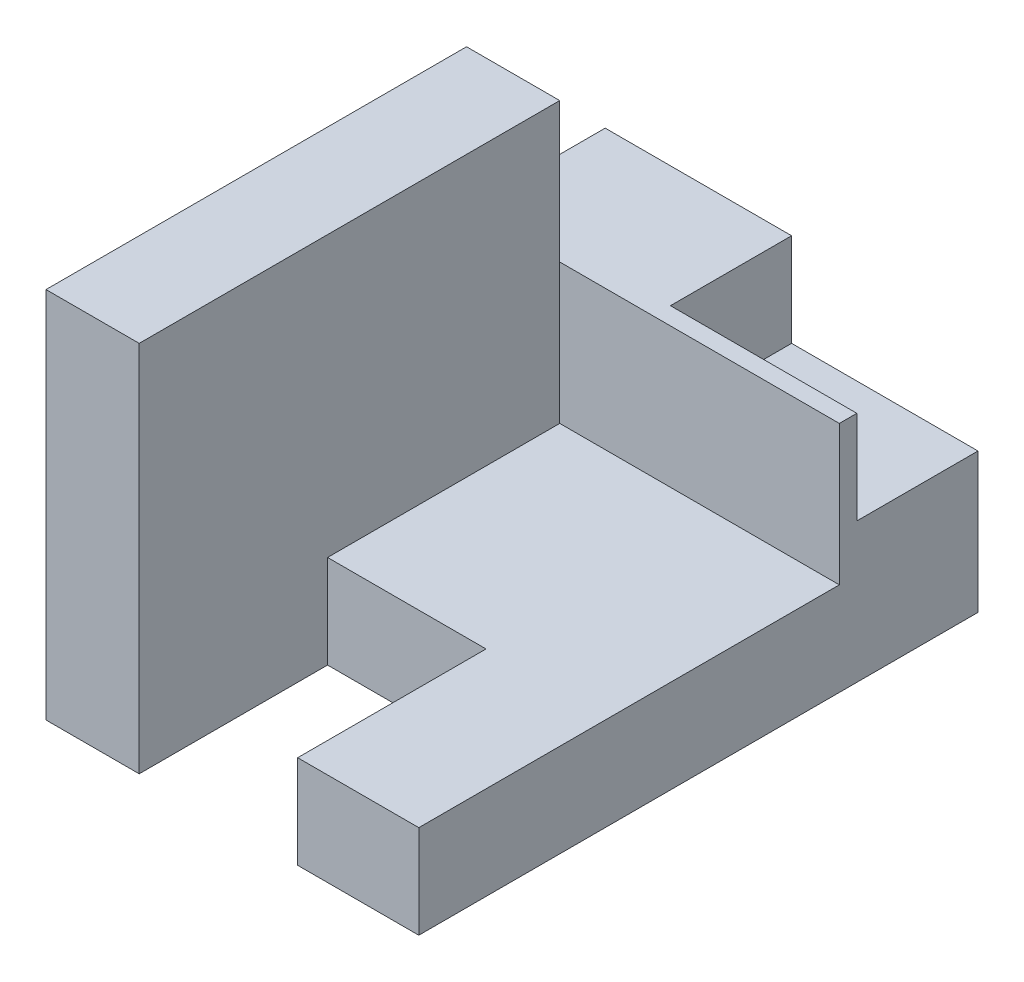
ISO-10303-21;
HEADER;
FILE_DESCRIPTION(('STEP AP214'),'2;1');
FILE_NAME('part.step','',(''),(''),'','','');
FILE_SCHEMA(('AUTOMOTIVE_DESIGN { 1 0 10303 214 1 1 1 1 }'));
ENDSEC;
DATA;
#1=APPLICATION_CONTEXT('core data for automotive mechanical design processes');
#2=APPLICATION_PROTOCOL_DEFINITION('international standard','automotive_design',2000,#1);
#3=PRODUCT_CONTEXT('',#1,'mechanical');
#4=PRODUCT('Part','Part','',(#3));
#5=PRODUCT_RELATED_PRODUCT_CATEGORY('part','',(#4));
#6=PRODUCT_DEFINITION_FORMATION('','',#4);
#7=PRODUCT_DEFINITION_CONTEXT('part definition',#1,'design');
#8=PRODUCT_DEFINITION('design','',#6,#7);
#9=PRODUCT_DEFINITION_SHAPE('','',#8);
#10=(LENGTH_UNIT() NAMED_UNIT(*) SI_UNIT(.MILLI.,.METRE.));
#11=(NAMED_UNIT(*) PLANE_ANGLE_UNIT() SI_UNIT($,.RADIAN.));
#12=(NAMED_UNIT(*) SI_UNIT($,.STERADIAN.) SOLID_ANGLE_UNIT());
#13=UNCERTAINTY_MEASURE_WITH_UNIT(LENGTH_MEASURE(1.E-05),#10,'distance_accuracy_value','');
#14=(GEOMETRIC_REPRESENTATION_CONTEXT(3) GLOBAL_UNCERTAINTY_ASSIGNED_CONTEXT((#13)) GLOBAL_UNIT_ASSIGNED_CONTEXT((#10,
#11,#12)) REPRESENTATION_CONTEXT('',''));
#15=CARTESIAN_POINT('',(0.,0.,0.));
#16=DIRECTION('',(0.,0.,1.));
#17=DIRECTION('',(1.,0.,0.));
#18=AXIS2_PLACEMENT_3D('',#15,#16,#17);
#19=CARTESIAN_POINT('',(40.,0.,60.));
#20=DIRECTION('',(-1.,0.,0.));
#21=DIRECTION('',(0.,0.,1.));
#22=AXIS2_PLACEMENT_3D('',#19,#20,#21);
#23=PLANE('',#22);
#24=DIRECTION('',(0.,0.,-1.));
#25=VECTOR('',#24,1.);
#26=CARTESIAN_POINT('',(40.,15.,0.));
#27=LINE('',#26,#25);
#28=CARTESIAN_POINT('',(40.,15.,13.));
#29=VERTEX_POINT('',#28);
#30=CARTESIAN_POINT('',(40.,15.,0.));
#31=VERTEX_POINT('',#30);
#32=EDGE_CURVE('E148',#29,#31,#27,.T.);
#33=ORIENTED_EDGE('',*,*,#32,.F.);
#34=DIRECTION('',(0.,1.,0.));
#35=VECTOR('',#34,1.);
#36=CARTESIAN_POINT('',(40.,15.,13.));
#37=LINE('',#36,#35);
#38=CARTESIAN_POINT('',(40.,25.,13.));
#39=VERTEX_POINT('',#38);
#40=EDGE_CURVE('E159',#29,#39,#37,.T.);
#41=ORIENTED_EDGE('',*,*,#40,.T.);
#42=DIRECTION('',(0.,0.,-1.));
#43=VECTOR('',#42,1.);
#44=CARTESIAN_POINT('',(40.,25.,0.));
#45=LINE('',#44,#43);
#46=CARTESIAN_POINT('',(40.,25.,14.8777848939515));
#47=VERTEX_POINT('',#46);
#48=EDGE_CURVE('E168',#47,#39,#45,.T.);
#49=ORIENTED_EDGE('',*,*,#48,.F.);
#50=DIRECTION('',(0.,1.,0.));
#51=VECTOR('',#50,1.);
#52=CARTESIAN_POINT('',(40.,10.,14.8777848939515));
#53=LINE('',#52,#51);
#54=CARTESIAN_POINT('',(40.,10.,14.8777848939515));
#55=VERTEX_POINT('',#54);
#56=EDGE_CURVE('E184',#55,#47,#53,.T.);
#57=ORIENTED_EDGE('',*,*,#56,.F.);
#58=DIRECTION('',(0.,0.,-1.));
#59=VECTOR('',#58,1.);
#60=CARTESIAN_POINT('',(40.,10.,60.));
#61=LINE('',#60,#59);
#62=CARTESIAN_POINT('',(40.,10.,60.));
#63=VERTEX_POINT('',#62);
#64=EDGE_CURVE('E179',#63,#55,#61,.T.);
#65=ORIENTED_EDGE('',*,*,#64,.F.);
#66=DIRECTION('',(0.,1.,0.));
#67=VECTOR('',#66,1.);
#68=CARTESIAN_POINT('',(40.,0.,60.));
#69=LINE('',#68,#67);
#70=CARTESIAN_POINT('',(40.,0.,60.));
#71=VERTEX_POINT('',#70);
#72=EDGE_CURVE('E221',#71,#63,#69,.T.);
#73=ORIENTED_EDGE('',*,*,#72,.F.);
#74=DIRECTION('',(0.,0.,-1.));
#75=VECTOR('',#74,1.);
#76=CARTESIAN_POINT('',(40.,0.,60.));
#77=LINE('',#76,#75);
#78=CARTESIAN_POINT('',(40.,0.,0.));
#79=VERTEX_POINT('',#78);
#80=EDGE_CURVE('E233',#71,#79,#77,.T.);
#81=ORIENTED_EDGE('',*,*,#80,.T.);
#82=DIRECTION('',(0.,1.,0.));
#83=VECTOR('',#82,1.);
#84=CARTESIAN_POINT('',(40.,0.,0.));
#85=LINE('',#84,#83);
#86=EDGE_CURVE('E217',#79,#31,#85,.T.);
#87=ORIENTED_EDGE('',*,*,#86,.T.);
#88=EDGE_LOOP('',(#33,#41,#49,#57,#65,#73,#81,#87));
#89=FACE_BOUND('',#88,.T.);
#90=ADVANCED_FACE('F33',(#89),#23,.F.);
#91=CARTESIAN_POINT('',(0.,0.,0.));
#92=DIRECTION('',(0.,0.,-1.));
#93=DIRECTION('',(-1.,0.,0.));
#94=AXIS2_PLACEMENT_3D('',#91,#92,#93);
#95=PLANE('',#94);
#96=DIRECTION('',(0.,1.,0.));
#97=VECTOR('',#96,1.);
#98=CARTESIAN_POINT('',(20.,15.,0.));
#99=LINE('',#98,#97);
#100=CARTESIAN_POINT('',(20.,15.,0.));
#101=VERTEX_POINT('',#100);
#102=CARTESIAN_POINT('',(20.,25.,0.));
#103=VERTEX_POINT('',#102);
#104=EDGE_CURVE('E48',#101,#103,#99,.T.);
#105=ORIENTED_EDGE('',*,*,#104,.F.);
#106=DIRECTION('',(-1.,0.,0.));
#107=VECTOR('',#106,1.);
#108=CARTESIAN_POINT('',(20.,15.,0.));
#109=LINE('',#108,#107);
#110=EDGE_CURVE('E143',#31,#101,#109,.T.);
#111=ORIENTED_EDGE('',*,*,#110,.F.);
#112=ORIENTED_EDGE('',*,*,#86,.F.);
#113=DIRECTION('',(1.,0.,0.));
#114=VECTOR('',#113,1.);
#115=CARTESIAN_POINT('',(0.,0.,0.));
#116=LINE('',#115,#114);
#117=CARTESIAN_POINT('',(0.,0.,0.));
#118=VERTEX_POINT('',#117);
#119=EDGE_CURVE('E228',#118,#79,#116,.T.);
#120=ORIENTED_EDGE('',*,*,#119,.F.);
#121=DIRECTION('',(0.,-1.,0.));
#122=VECTOR('',#121,1.);
#123=CARTESIAN_POINT('',(0.,0.,0.));
#124=LINE('',#123,#122);
#125=CARTESIAN_POINT('',(0.,25.,0.));
#126=VERTEX_POINT('',#125);
#127=EDGE_CURVE('E212',#126,#118,#124,.T.);
#128=ORIENTED_EDGE('',*,*,#127,.F.);
#129=DIRECTION('',(-1.,0.,0.));
#130=VECTOR('',#129,1.);
#131=CARTESIAN_POINT('',(0.,25.,0.));
#132=LINE('',#131,#130);
#133=EDGE_CURVE('E157',#103,#126,#132,.T.);
#134=ORIENTED_EDGE('',*,*,#133,.F.);
#135=EDGE_LOOP('',(#105,#111,#112,#120,#128,#134));
#136=FACE_BOUND('',#135,.T.);
#137=ADVANCED_FACE('F155',(#136),#95,.T.);
#138=CARTESIAN_POINT('',(10.,10.,14.8777848939515));
#139=DIRECTION('',(0.,0.,-1.));
#140=DIRECTION('',(-1.,0.,0.));
#141=AXIS2_PLACEMENT_3D('',#138,#139,#140);
#142=PLANE('',#141);
#143=DIRECTION('',(1.,0.,0.));
#144=VECTOR('',#143,1.);
#145=CARTESIAN_POINT('',(10.,25.,14.8777848939515));
#146=LINE('',#145,#144);
#147=CARTESIAN_POINT('',(10.,25.,14.8777848939515));
#148=VERTEX_POINT('',#147);
#149=EDGE_CURVE('E11',#148,#47,#146,.T.);
#150=ORIENTED_EDGE('',*,*,#149,.F.);
#151=DIRECTION('',(0.,1.,0.));
#152=VECTOR('',#151,1.);
#153=CARTESIAN_POINT('',(10.,10.,14.8777848939515));
#154=LINE('',#153,#152);
#155=CARTESIAN_POINT('',(10.,10.,14.8777848939515));
#156=VERTEX_POINT('',#155);
#157=EDGE_CURVE('E185',#156,#148,#154,.T.);
#158=ORIENTED_EDGE('',*,*,#157,.F.);
#159=DIRECTION('',(-1.,0.,0.));
#160=VECTOR('',#159,1.);
#161=CARTESIAN_POINT('',(10.,10.,14.8777848939515));
#162=LINE('',#161,#160);
#163=EDGE_CURVE('E181',#55,#156,#162,.T.);
#164=ORIENTED_EDGE('',*,*,#163,.F.);
#165=ORIENTED_EDGE('',*,*,#56,.T.);
#166=EDGE_LOOP('',(#150,#158,#164,#165));
#167=FACE_BOUND('',#166,.T.);
#168=ADVANCED_FACE('F269',(#167),#142,.F.);
#169=CARTESIAN_POINT('',(0.,0.,60.));
#170=DIRECTION('',(0.,0.,-1.));
#171=DIRECTION('',(-1.,0.,0.));
#172=AXIS2_PLACEMENT_3D('',#169,#170,#171);
#173=PLANE('',#172);
#174=DIRECTION('',(1.,0.,0.));
#175=VECTOR('',#174,1.);
#176=CARTESIAN_POINT('',(0.,0.,60.));
#177=LINE('',#176,#175);
#178=CARTESIAN_POINT('',(0.,0.,60.));
#179=VERTEX_POINT('',#178);
#180=CARTESIAN_POINT('',(10.,0.,60.));
#181=VERTEX_POINT('',#180);
#182=EDGE_CURVE('E218',#179,#181,#177,.T.);
#183=ORIENTED_EDGE('',*,*,#182,.T.);
#184=DIRECTION('',(0.,1.,0.));
#185=VECTOR('',#184,1.);
#186=CARTESIAN_POINT('',(10.,0.,60.));
#187=LINE('',#186,#185);
#188=CARTESIAN_POINT('',(10.,40.,60.));
#189=VERTEX_POINT('',#188);
#190=EDGE_CURVE('E241',#181,#189,#187,.T.);
#191=ORIENTED_EDGE('',*,*,#190,.T.);
#192=DIRECTION('',(-1.,0.,0.));
#193=VECTOR('',#192,1.);
#194=CARTESIAN_POINT('',(0.,40.,60.));
#195=LINE('',#194,#193);
#196=CARTESIAN_POINT('',(0.,40.,60.));
#197=VERTEX_POINT('',#196);
#198=EDGE_CURVE('E224',#189,#197,#195,.T.);
#199=ORIENTED_EDGE('',*,*,#198,.T.);
#200=DIRECTION('',(0.,-1.,0.));
#201=VECTOR('',#200,1.);
#202=CARTESIAN_POINT('',(0.,0.,60.));
#203=LINE('',#202,#201);
#204=EDGE_CURVE('E213',#197,#179,#203,.T.);
#205=ORIENTED_EDGE('',*,*,#204,.T.);
#206=EDGE_LOOP('',(#183,#191,#199,#205));
#207=FACE_BOUND('',#206,.T.);
#208=ADVANCED_FACE('F277',(#207),#173,.F.);
#209=CARTESIAN_POINT('',(0.,0.,60.));
#210=DIRECTION('',(1.,0.,0.));
#211=DIRECTION('',(0.,0.,-1.));
#212=AXIS2_PLACEMENT_3D('',#209,#210,#211);
#213=PLANE('',#212);
#214=DIRECTION('',(0.,0.,-1.));
#215=VECTOR('',#214,1.);
#216=CARTESIAN_POINT('',(0.,40.,60.));
#217=LINE('',#216,#215);
#218=CARTESIAN_POINT('',(0.,40.,14.8777848939515));
#219=VERTEX_POINT('',#218);
#220=EDGE_CURVE('E226',#197,#219,#217,.T.);
#221=ORIENTED_EDGE('',*,*,#220,.T.);
#222=DIRECTION('',(0.,1.,0.));
#223=VECTOR('',#222,1.);
#224=CARTESIAN_POINT('',(0.,25.,14.8777848939515));
#225=LINE('',#224,#223);
#226=CARTESIAN_POINT('',(0.,25.,14.8777848939515));
#227=VERTEX_POINT('',#226);
#228=EDGE_CURVE('E172',#227,#219,#225,.T.);
#229=ORIENTED_EDGE('',*,*,#228,.F.);
#230=DIRECTION('',(0.,0.,1.));
#231=VECTOR('',#230,1.);
#232=CARTESIAN_POINT('',(0.,25.,0.));
#233=LINE('',#232,#231);
#234=EDGE_CURVE('E164',#126,#227,#233,.T.);
#235=ORIENTED_EDGE('',*,*,#234,.F.);
#236=ORIENTED_EDGE('',*,*,#127,.T.);
#237=DIRECTION('',(0.,0.,-1.));
#238=VECTOR('',#237,1.);
#239=CARTESIAN_POINT('',(0.,0.,60.));
#240=LINE('',#239,#238);
#241=EDGE_CURVE('E236',#179,#118,#240,.T.);
#242=ORIENTED_EDGE('',*,*,#241,.F.);
#243=ORIENTED_EDGE('',*,*,#204,.F.);
#244=EDGE_LOOP('',(#221,#229,#235,#236,#242,#243));
#245=FACE_BOUND('',#244,.T.);
#246=ADVANCED_FACE('F35',(#245),#213,.F.);
#247=CARTESIAN_POINT('',(0.,0.,60.));
#248=DIRECTION('',(0.,1.,0.));
#249=DIRECTION('',(0.,0.,1.));
#250=AXIS2_PLACEMENT_3D('',#247,#248,#249);
#251=PLANE('',#250);
#252=DIRECTION('',(-1.,0.,0.));
#253=VECTOR('',#252,1.);
#254=CARTESIAN_POINT('',(0.,0.,39.7896445160205));
#255=LINE('',#254,#253);
#256=CARTESIAN_POINT('',(27.003973312275,0.,39.7896445160205));
#257=VERTEX_POINT('',#256);
#258=CARTESIAN_POINT('',(10.,0.,39.7896445160205));
#259=VERTEX_POINT('',#258);
#260=EDGE_CURVE('E209',#257,#259,#255,.T.);
#261=ORIENTED_EDGE('',*,*,#260,.T.);
#262=DIRECTION('',(0.,0.,1.));
#263=VECTOR('',#262,1.);
#264=CARTESIAN_POINT('',(10.,0.,60.));
#265=LINE('',#264,#263);
#266=EDGE_CURVE('E206',#259,#181,#265,.T.);
#267=ORIENTED_EDGE('',*,*,#266,.T.);
#268=ORIENTED_EDGE('',*,*,#182,.F.);
#269=ORIENTED_EDGE('',*,*,#241,.T.);
#270=ORIENTED_EDGE('',*,*,#119,.T.);
#271=ORIENTED_EDGE('',*,*,#80,.F.);
#272=CARTESIAN_POINT('',(27.003973312275,0.,60.));
#273=VERTEX_POINT('',#272);
#274=EDGE_CURVE('E216',#273,#71,#177,.T.);
#275=ORIENTED_EDGE('',*,*,#274,.F.);
#276=DIRECTION('',(0.,0.,-1.));
#277=VECTOR('',#276,1.);
#278=CARTESIAN_POINT('',(27.003973312275,0.,60.));
#279=LINE('',#278,#277);
#280=EDGE_CURVE('E201',#273,#257,#279,.T.);
#281=ORIENTED_EDGE('',*,*,#280,.T.);
#282=EDGE_LOOP('',(#261,#267,#268,#269,#270,#271,#275,#281));
#283=FACE_BOUND('',#282,.T.);
#284=ADVANCED_FACE('F254',(#283),#251,.F.);
#285=CARTESIAN_POINT('',(0.,40.,60.));
#286=DIRECTION('',(0.,-1.,0.));
#287=DIRECTION('',(0.,0.,-1.));
#288=AXIS2_PLACEMENT_3D('',#285,#286,#287);
#289=PLANE('',#288);
#290=DIRECTION('',(0.,0.,1.));
#291=VECTOR('',#290,1.);
#292=CARTESIAN_POINT('',(10.,40.,60.));
#293=LINE('',#292,#291);
#294=CARTESIAN_POINT('',(10.,40.,14.8777848939515));
#295=VERTEX_POINT('',#294);
#296=EDGE_CURVE('E194',#295,#189,#293,.T.);
#297=ORIENTED_EDGE('',*,*,#296,.F.);
#298=DIRECTION('',(1.,0.,0.));
#299=VECTOR('',#298,1.);
#300=CARTESIAN_POINT('',(0.,40.,14.8777848939515));
#301=LINE('',#300,#299);
#302=EDGE_CURVE('E166',#219,#295,#301,.T.);
#303=ORIENTED_EDGE('',*,*,#302,.F.);
#304=ORIENTED_EDGE('',*,*,#220,.F.);
#305=ORIENTED_EDGE('',*,*,#198,.F.);
#306=EDGE_LOOP('',(#297,#303,#304,#305));
#307=FACE_BOUND('',#306,.T.);
#308=ADVANCED_FACE('F310',(#307),#289,.F.);
#309=ORIENTED_EDGE('',*,*,#72,.T.);
#310=DIRECTION('',(1.,0.,0.));
#311=VECTOR('',#310,1.);
#312=CARTESIAN_POINT('',(10.,10.,60.));
#313=LINE('',#312,#311);
#314=CARTESIAN_POINT('',(27.003973312275,10.,60.));
#315=VERTEX_POINT('',#314);
#316=EDGE_CURVE('E177',#315,#63,#313,.T.);
#317=ORIENTED_EDGE('',*,*,#316,.F.);
#318=DIRECTION('',(0.,-1.,0.));
#319=VECTOR('',#318,1.);
#320=CARTESIAN_POINT('',(27.003973312275,0.,60.));
#321=LINE('',#320,#319);
#322=EDGE_CURVE('E239',#315,#273,#321,.T.);
#323=ORIENTED_EDGE('',*,*,#322,.T.);
#324=ORIENTED_EDGE('',*,*,#274,.T.);
#325=EDGE_LOOP('',(#309,#317,#323,#324));
#326=FACE_BOUND('',#325,.T.);
#327=ADVANCED_FACE('F259',(#326),#173,.F.);
#328=CARTESIAN_POINT('',(10.,-9.99999999999999,39.7896445160205));
#329=DIRECTION('',(0.,0.,-1.));
#330=DIRECTION('',(-1.,0.,0.));
#331=AXIS2_PLACEMENT_3D('',#328,#329,#330);
#332=PLANE('',#331);
#333=DIRECTION('',(0.,1.,0.));
#334=VECTOR('',#333,1.);
#335=CARTESIAN_POINT('',(27.003973312275,-9.99999999999999,39.7896445160205));
#336=LINE('',#335,#334);
#337=CARTESIAN_POINT('',(27.003973312275,10.,39.7896445160205));
#338=VERTEX_POINT('',#337);
#339=EDGE_CURVE('E197',#257,#338,#336,.T.);
#340=ORIENTED_EDGE('',*,*,#339,.T.);
#341=DIRECTION('',(-1.,0.,0.));
#342=VECTOR('',#341,1.);
#343=CARTESIAN_POINT('',(10.,10.,39.7896445160205));
#344=LINE('',#343,#342);
#345=CARTESIAN_POINT('',(10.,10.,39.7896445160205));
#346=VERTEX_POINT('',#345);
#347=EDGE_CURVE('E188',#338,#346,#344,.T.);
#348=ORIENTED_EDGE('',*,*,#347,.T.);
#349=DIRECTION('',(0.,1.,0.));
#350=VECTOR('',#349,1.);
#351=CARTESIAN_POINT('',(10.,-9.99999999999999,39.7896445160205));
#352=LINE('',#351,#350);
#353=EDGE_CURVE('E198',#259,#346,#352,.T.);
#354=ORIENTED_EDGE('',*,*,#353,.F.);
#355=ORIENTED_EDGE('',*,*,#260,.F.);
#356=EDGE_LOOP('',(#340,#348,#354,#355));
#357=FACE_BOUND('',#356,.T.);
#358=ADVANCED_FACE('F251',(#357),#332,.F.);
#359=CARTESIAN_POINT('',(10.,-9.99999999999999,60.));
#360=DIRECTION('',(-1.,0.,0.));
#361=DIRECTION('',(0.,0.,1.));
#362=AXIS2_PLACEMENT_3D('',#359,#360,#361);
#363=PLANE('',#362);
#364=ORIENTED_EDGE('',*,*,#353,.T.);
#365=DIRECTION('',(0.,0.,1.));
#366=VECTOR('',#365,1.);
#367=CARTESIAN_POINT('',(10.,10.,60.));
#368=LINE('',#367,#366);
#369=EDGE_CURVE('E175',#156,#346,#368,.T.);
#370=ORIENTED_EDGE('',*,*,#369,.F.);
#371=ORIENTED_EDGE('',*,*,#157,.T.);
#372=EDGE_CURVE('E189',#148,#295,#154,.T.);
#373=ORIENTED_EDGE('',*,*,#372,.T.);
#374=ORIENTED_EDGE('',*,*,#296,.T.);
#375=ORIENTED_EDGE('',*,*,#190,.F.);
#376=ORIENTED_EDGE('',*,*,#266,.F.);
#377=EDGE_LOOP('',(#364,#370,#371,#373,#374,#375,#376));
#378=FACE_BOUND('',#377,.T.);
#379=ADVANCED_FACE('F272',(#378),#363,.F.);
#380=CARTESIAN_POINT('',(27.003973312275,-9.99999999999999,60.));
#381=DIRECTION('',(1.,0.,0.));
#382=DIRECTION('',(0.,0.,-1.));
#383=AXIS2_PLACEMENT_3D('',#380,#381,#382);
#384=PLANE('',#383);
#385=ORIENTED_EDGE('',*,*,#322,.F.);
#386=DIRECTION('',(0.,0.,-1.));
#387=VECTOR('',#386,1.);
#388=CARTESIAN_POINT('',(27.003973312275,10.,60.));
#389=LINE('',#388,#387);
#390=EDGE_CURVE('E41',#315,#338,#389,.T.);
#391=ORIENTED_EDGE('',*,*,#390,.T.);
#392=ORIENTED_EDGE('',*,*,#339,.F.);
#393=ORIENTED_EDGE('',*,*,#280,.F.);
#394=EDGE_LOOP('',(#385,#391,#392,#393));
#395=FACE_BOUND('',#394,.T.);
#396=ADVANCED_FACE('F246',(#395),#384,.F.);
#397=CARTESIAN_POINT('',(0.,10.,0.));
#398=DIRECTION('',(0.,-1.,0.));
#399=DIRECTION('',(0.,0.,-1.));
#400=AXIS2_PLACEMENT_3D('',#397,#398,#399);
#401=PLANE('',#400);
#402=ORIENTED_EDGE('',*,*,#390,.F.);
#403=ORIENTED_EDGE('',*,*,#316,.T.);
#404=ORIENTED_EDGE('',*,*,#64,.T.);
#405=ORIENTED_EDGE('',*,*,#163,.T.);
#406=ORIENTED_EDGE('',*,*,#369,.T.);
#407=ORIENTED_EDGE('',*,*,#347,.F.);
#408=EDGE_LOOP('',(#402,#403,#404,#405,#406,#407));
#409=FACE_BOUND('',#408,.T.);
#410=ADVANCED_FACE('F261',(#409),#401,.F.);
#411=CARTESIAN_POINT('',(0.,25.,14.8777848939515));
#412=DIRECTION('',(0.,0.,1.));
#413=DIRECTION('',(1.,0.,0.));
#414=AXIS2_PLACEMENT_3D('',#411,#412,#413);
#415=PLANE('',#414);
#416=DIRECTION('',(1.,0.,0.));
#417=VECTOR('',#416,1.);
#418=CARTESIAN_POINT('',(0.,25.,14.8777848939515));
#419=LINE('',#418,#417);
#420=EDGE_CURVE('E55',#227,#148,#419,.T.);
#421=ORIENTED_EDGE('',*,*,#420,.F.);
#422=ORIENTED_EDGE('',*,*,#228,.T.);
#423=ORIENTED_EDGE('',*,*,#302,.T.);
#424=ORIENTED_EDGE('',*,*,#372,.F.);
#425=EDGE_LOOP('',(#421,#422,#423,#424));
#426=FACE_BOUND('',#425,.T.);
#427=ADVANCED_FACE('F300',(#426),#415,.F.);
#428=CARTESIAN_POINT('',(0.,25.,0.));
#429=DIRECTION('',(0.,1.,0.));
#430=DIRECTION('',(0.,0.,1.));
#431=AXIS2_PLACEMENT_3D('',#428,#429,#430);
#432=PLANE('',#431);
#433=DIRECTION('',(1.,0.,0.));
#434=VECTOR('',#433,1.);
#435=CARTESIAN_POINT('',(20.,25.,13.));
#436=LINE('',#435,#434);
#437=CARTESIAN_POINT('',(20.,25.,13.));
#438=VERTEX_POINT('',#437);
#439=EDGE_CURVE('E152',#438,#39,#436,.T.);
#440=ORIENTED_EDGE('',*,*,#439,.F.);
#441=DIRECTION('',(0.,0.,1.));
#442=VECTOR('',#441,1.);
#443=CARTESIAN_POINT('',(20.,25.,13.));
#444=LINE('',#443,#442);
#445=EDGE_CURVE('E288',#103,#438,#444,.T.);
#446=ORIENTED_EDGE('',*,*,#445,.F.);
#447=ORIENTED_EDGE('',*,*,#133,.T.);
#448=ORIENTED_EDGE('',*,*,#234,.T.);
#449=ORIENTED_EDGE('',*,*,#420,.T.);
#450=ORIENTED_EDGE('',*,*,#149,.T.);
#451=ORIENTED_EDGE('',*,*,#48,.T.);
#452=EDGE_LOOP('',(#440,#446,#447,#448,#449,#450,#451));
#453=FACE_BOUND('',#452,.T.);
#454=ADVANCED_FACE('F287',(#453),#432,.T.);
#455=CARTESIAN_POINT('',(20.,15.,13.));
#456=DIRECTION('',(0.,0.,1.));
#457=DIRECTION('',(1.,0.,0.));
#458=AXIS2_PLACEMENT_3D('',#455,#456,#457);
#459=PLANE('',#458);
#460=ORIENTED_EDGE('',*,*,#439,.T.);
#461=ORIENTED_EDGE('',*,*,#40,.F.);
#462=DIRECTION('',(1.,0.,0.));
#463=VECTOR('',#462,1.);
#464=CARTESIAN_POINT('',(20.,15.,13.));
#465=LINE('',#464,#463);
#466=CARTESIAN_POINT('',(20.,15.,13.));
#467=VERTEX_POINT('',#466);
#468=EDGE_CURVE('E142',#467,#29,#465,.T.);
#469=ORIENTED_EDGE('',*,*,#468,.F.);
#470=DIRECTION('',(0.,1.,0.));
#471=VECTOR('',#470,1.);
#472=CARTESIAN_POINT('',(20.,15.,13.));
#473=LINE('',#472,#471);
#474=EDGE_CURVE('E138',#467,#438,#473,.T.);
#475=ORIENTED_EDGE('',*,*,#474,.T.);
#476=EDGE_LOOP('',(#460,#461,#469,#475));
#477=FACE_BOUND('',#476,.T.);
#478=ADVANCED_FACE('F292',(#477),#459,.F.);
#479=CARTESIAN_POINT('',(20.,15.,13.));
#480=DIRECTION('',(-1.,0.,0.));
#481=DIRECTION('',(0.,0.,1.));
#482=AXIS2_PLACEMENT_3D('',#479,#480,#481);
#483=PLANE('',#482);
#484=ORIENTED_EDGE('',*,*,#445,.T.);
#485=ORIENTED_EDGE('',*,*,#474,.F.);
#486=DIRECTION('',(0.,0.,1.));
#487=VECTOR('',#486,1.);
#488=CARTESIAN_POINT('',(20.,15.,13.));
#489=LINE('',#488,#487);
#490=EDGE_CURVE('E135',#101,#467,#489,.T.);
#491=ORIENTED_EDGE('',*,*,#490,.F.);
#492=ORIENTED_EDGE('',*,*,#104,.T.);
#493=EDGE_LOOP('',(#484,#485,#491,#492));
#494=FACE_BOUND('',#493,.T.);
#495=ADVANCED_FACE('F137',(#494),#483,.F.);
#496=CARTESIAN_POINT('',(0.,15.,0.));
#497=DIRECTION('',(0.,-1.,0.));
#498=DIRECTION('',(0.,0.,-1.));
#499=AXIS2_PLACEMENT_3D('',#496,#497,#498);
#500=PLANE('',#499);
#501=ORIENTED_EDGE('',*,*,#110,.T.);
#502=ORIENTED_EDGE('',*,*,#490,.T.);
#503=ORIENTED_EDGE('',*,*,#468,.T.);
#504=ORIENTED_EDGE('',*,*,#32,.T.);
#505=EDGE_LOOP('',(#501,#502,#503,#504));
#506=FACE_BOUND('',#505,.T.);
#507=ADVANCED_FACE('F146',(#506),#500,.F.);
#508=CLOSED_SHELL('',(#90,#137,#168,#208,#246,#284,#308,#327,#358,#379,#396,#410,#427,#454,#478,
#495,#507));
#509=MANIFOLD_SOLID_BREP('B2',#508);
#510=ADVANCED_BREP_SHAPE_REPRESENTATION('',(#18,#509),#14);
#511=SHAPE_DEFINITION_REPRESENTATION(#9,#510);
ENDSEC;
END-ISO-10303-21;
